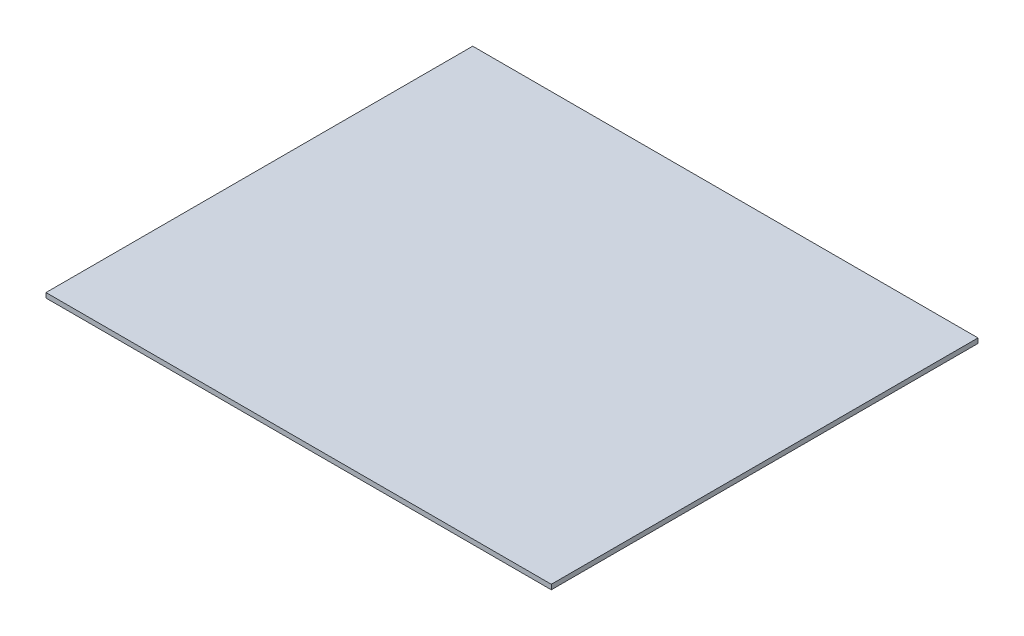
ISO-10303-21;
HEADER;
FILE_DESCRIPTION(('STEP AP214'),'2;1');
FILE_NAME('part.step','',(''),(''),'','','');
FILE_SCHEMA(('AUTOMOTIVE_DESIGN { 1 0 10303 214 1 1 1 1 }'));
ENDSEC;
DATA;
#1=APPLICATION_CONTEXT('core data for automotive mechanical design processes');
#2=APPLICATION_PROTOCOL_DEFINITION('international standard','automotive_design',2000,#1);
#3=PRODUCT_CONTEXT('',#1,'mechanical');
#4=PRODUCT('Part','Part','',(#3));
#5=PRODUCT_RELATED_PRODUCT_CATEGORY('part','',(#4));
#6=PRODUCT_DEFINITION_FORMATION('','',#4);
#7=PRODUCT_DEFINITION_CONTEXT('part definition',#1,'design');
#8=PRODUCT_DEFINITION('design','',#6,#7);
#9=PRODUCT_DEFINITION_SHAPE('','',#8);
#10=(LENGTH_UNIT() NAMED_UNIT(*) SI_UNIT(.MILLI.,.METRE.));
#11=(NAMED_UNIT(*) PLANE_ANGLE_UNIT() SI_UNIT($,.RADIAN.));
#12=(NAMED_UNIT(*) SI_UNIT($,.STERADIAN.) SOLID_ANGLE_UNIT());
#13=UNCERTAINTY_MEASURE_WITH_UNIT(LENGTH_MEASURE(1.E-05),#10,'distance_accuracy_value','');
#14=(GEOMETRIC_REPRESENTATION_CONTEXT(3) GLOBAL_UNCERTAINTY_ASSIGNED_CONTEXT((#13)) GLOBAL_UNIT_ASSIGNED_CONTEXT((#10,
#11,#12)) REPRESENTATION_CONTEXT('',''));
#15=CARTESIAN_POINT('',(0.,0.,0.));
#16=DIRECTION('',(0.,0.,1.));
#17=DIRECTION('',(1.,0.,0.));
#18=AXIS2_PLACEMENT_3D('',#15,#16,#17);
#19=CARTESIAN_POINT('',(-157.5,3.,-133.));
#20=DIRECTION('',(0.,0.,-1.));
#21=DIRECTION('',(-1.,0.,0.));
#22=AXIS2_PLACEMENT_3D('',#19,#20,#21);
#23=PLANE('',#22);
#24=DIRECTION('',(-1.,0.,0.));
#25=VECTOR('',#24,1.);
#26=CARTESIAN_POINT('',(102.25,2.,-133.));
#27=LINE('',#26,#25);
#28=CARTESIAN_POINT('',(102.25,2.,-133.));
#29=VERTEX_POINT('',#28);
#30=CARTESIAN_POINT('',(52.25,2.,-133.));
#31=VERTEX_POINT('',#30);
#32=EDGE_CURVE('E150',#29,#31,#27,.T.);
#33=ORIENTED_EDGE('',*,*,#32,.T.);
#34=DIRECTION('',(0.,-1.,0.));
#35=VECTOR('',#34,1.);
#36=CARTESIAN_POINT('',(52.25,2.,-133.));
#37=LINE('',#36,#35);
#38=CARTESIAN_POINT('',(52.25,0.,-133.));
#39=VERTEX_POINT('',#38);
#40=EDGE_CURVE('E131',#31,#39,#37,.T.);
#41=ORIENTED_EDGE('',*,*,#40,.T.);
#42=DIRECTION('',(1.,0.,0.));
#43=VECTOR('',#42,1.);
#44=CARTESIAN_POINT('',(-157.5,0.,-133.));
#45=LINE('',#44,#43);
#46=CARTESIAN_POINT('',(-52.25,0.,-133.));
#47=VERTEX_POINT('',#46);
#48=EDGE_CURVE('E242',#47,#39,#45,.T.);
#49=ORIENTED_EDGE('',*,*,#48,.F.);
#50=DIRECTION('',(0.,-1.,0.));
#51=VECTOR('',#50,1.);
#52=CARTESIAN_POINT('',(-52.25,2.,-133.));
#53=LINE('',#52,#51);
#54=CARTESIAN_POINT('',(-52.25,2.,-133.));
#55=VERTEX_POINT('',#54);
#56=EDGE_CURVE('E205',#55,#47,#53,.T.);
#57=ORIENTED_EDGE('',*,*,#56,.F.);
#58=DIRECTION('',(1.,0.,0.));
#59=VECTOR('',#58,1.);
#60=CARTESIAN_POINT('',(-102.25,2.,-133.));
#61=LINE('',#60,#59);
#62=CARTESIAN_POINT('',(-102.25,2.,-133.));
#63=VERTEX_POINT('',#62);
#64=EDGE_CURVE('E192',#63,#55,#61,.T.);
#65=ORIENTED_EDGE('',*,*,#64,.F.);
#66=DIRECTION('',(0.,-1.,0.));
#67=VECTOR('',#66,1.);
#68=CARTESIAN_POINT('',(-102.25,2.,-133.));
#69=LINE('',#68,#67);
#70=CARTESIAN_POINT('',(-102.25,0.,-133.));
#71=VERTEX_POINT('',#70);
#72=EDGE_CURVE('E209',#63,#71,#69,.T.);
#73=ORIENTED_EDGE('',*,*,#72,.T.);
#74=CARTESIAN_POINT('',(-157.5,0.,-133.));
#75=VERTEX_POINT('',#74);
#76=EDGE_CURVE('E237',#75,#71,#45,.T.);
#77=ORIENTED_EDGE('',*,*,#76,.F.);
#78=DIRECTION('',(0.,-1.,0.));
#79=VECTOR('',#78,1.);
#80=CARTESIAN_POINT('',(-157.5,3.,-133.));
#81=LINE('',#80,#79);
#82=CARTESIAN_POINT('',(-157.5,3.,-133.));
#83=VERTEX_POINT('',#82);
#84=EDGE_CURVE('E43',#83,#75,#81,.T.);
#85=ORIENTED_EDGE('',*,*,#84,.F.);
#86=DIRECTION('',(1.,0.,0.));
#87=VECTOR('',#86,1.);
#88=CARTESIAN_POINT('',(-157.5,3.,-133.));
#89=LINE('',#88,#87);
#90=CARTESIAN_POINT('',(157.5,3.,-133.));
#91=VERTEX_POINT('',#90);
#92=EDGE_CURVE('E222',#83,#91,#89,.T.);
#93=ORIENTED_EDGE('',*,*,#92,.T.);
#94=DIRECTION('',(0.,-1.,0.));
#95=VECTOR('',#94,1.);
#96=CARTESIAN_POINT('',(157.5,3.,-133.));
#97=LINE('',#96,#95);
#98=CARTESIAN_POINT('',(157.5,0.,-133.));
#99=VERTEX_POINT('',#98);
#100=EDGE_CURVE('E250',#91,#99,#97,.T.);
#101=ORIENTED_EDGE('',*,*,#100,.T.);
#102=CARTESIAN_POINT('',(102.25,0.,-133.));
#103=VERTEX_POINT('',#102);
#104=EDGE_CURVE('E236',#103,#99,#45,.T.);
#105=ORIENTED_EDGE('',*,*,#104,.F.);
#106=DIRECTION('',(0.,-1.,0.));
#107=VECTOR('',#106,1.);
#108=CARTESIAN_POINT('',(102.25,2.,-133.));
#109=LINE('',#108,#107);
#110=EDGE_CURVE('E57',#29,#103,#109,.T.);
#111=ORIENTED_EDGE('',*,*,#110,.F.);
#112=EDGE_LOOP('',(#33,#41,#49,#57,#65,#73,#77,#85,#93,#101,#105,#111));
#113=FACE_BOUND('',#112,.T.);
#114=ADVANCED_FACE('F39',(#113),#23,.T.);
#115=CARTESIAN_POINT('',(0.,0.,0.));
#116=DIRECTION('',(0.,-1.,0.));
#117=DIRECTION('',(0.,0.,-1.));
#118=AXIS2_PLACEMENT_3D('',#115,#116,#117);
#119=PLANE('',#118);
#120=ORIENTED_EDGE('',*,*,#48,.T.);
#121=DIRECTION('',(0.,0.,1.));
#122=VECTOR('',#121,1.);
#123=CARTESIAN_POINT('',(52.25,0.,-133.));
#124=LINE('',#123,#122);
#125=CARTESIAN_POINT('',(52.25,0.,-98.));
#126=VERTEX_POINT('',#125);
#127=EDGE_CURVE('E138',#39,#126,#124,.T.);
#128=ORIENTED_EDGE('',*,*,#127,.T.);
#129=DIRECTION('',(1.,0.,0.));
#130=VECTOR('',#129,1.);
#131=CARTESIAN_POINT('',(52.25,0.,-98.));
#132=LINE('',#131,#130);
#133=CARTESIAN_POINT('',(102.25,0.,-98.));
#134=VERTEX_POINT('',#133);
#135=EDGE_CURVE('E152',#126,#134,#132,.T.);
#136=ORIENTED_EDGE('',*,*,#135,.T.);
#137=DIRECTION('',(0.,0.,-1.));
#138=VECTOR('',#137,1.);
#139=CARTESIAN_POINT('',(102.25,0.,-98.));
#140=LINE('',#139,#138);
#141=EDGE_CURVE('E165',#134,#103,#140,.T.);
#142=ORIENTED_EDGE('',*,*,#141,.T.);
#143=ORIENTED_EDGE('',*,*,#104,.T.);
#144=DIRECTION('',(0.,0.,-1.));
#145=VECTOR('',#144,1.);
#146=CARTESIAN_POINT('',(157.5,0.,133.));
#147=LINE('',#146,#145);
#148=CARTESIAN_POINT('',(157.5,0.,133.));
#149=VERTEX_POINT('',#148);
#150=EDGE_CURVE('E241',#149,#99,#147,.T.);
#151=ORIENTED_EDGE('',*,*,#150,.F.);
#152=DIRECTION('',(1.,0.,0.));
#153=VECTOR('',#152,1.);
#154=CARTESIAN_POINT('',(-157.5,0.,133.));
#155=LINE('',#154,#153);
#156=CARTESIAN_POINT('',(-157.5,0.,133.));
#157=VERTEX_POINT('',#156);
#158=EDGE_CURVE('E223',#157,#149,#155,.T.);
#159=ORIENTED_EDGE('',*,*,#158,.F.);
#160=DIRECTION('',(0.,0.,-1.));
#161=VECTOR('',#160,1.);
#162=CARTESIAN_POINT('',(-157.5,0.,133.));
#163=LINE('',#162,#161);
#164=EDGE_CURVE('E208',#157,#75,#163,.T.);
#165=ORIENTED_EDGE('',*,*,#164,.T.);
#166=ORIENTED_EDGE('',*,*,#76,.T.);
#167=DIRECTION('',(0.,0.,-1.));
#168=VECTOR('',#167,1.);
#169=CARTESIAN_POINT('',(-102.25,0.,-98.));
#170=LINE('',#169,#168);
#171=CARTESIAN_POINT('',(-102.25,0.,-98.));
#172=VERTEX_POINT('',#171);
#173=EDGE_CURVE('E184',#172,#71,#170,.T.);
#174=ORIENTED_EDGE('',*,*,#173,.F.);
#175=DIRECTION('',(-1.,0.,0.));
#176=VECTOR('',#175,1.);
#177=CARTESIAN_POINT('',(-52.25,0.,-98.));
#178=LINE('',#177,#176);
#179=CARTESIAN_POINT('',(-52.25,0.,-98.));
#180=VERTEX_POINT('',#179);
#181=EDGE_CURVE('E199',#180,#172,#178,.T.);
#182=ORIENTED_EDGE('',*,*,#181,.F.);
#183=DIRECTION('',(0.,0.,1.));
#184=VECTOR('',#183,1.);
#185=CARTESIAN_POINT('',(-52.25,0.,-133.));
#186=LINE('',#185,#184);
#187=EDGE_CURVE('E65',#47,#180,#186,.T.);
#188=ORIENTED_EDGE('',*,*,#187,.F.);
#189=EDGE_LOOP('',(#120,#128,#136,#142,#143,#151,#159,#165,#166,#174,#182,#188));
#190=FACE_BOUND('',#189,.T.);
#191=ADVANCED_FACE('F264',(#190),#119,.T.);
#192=CARTESIAN_POINT('',(-157.5,3.,133.));
#193=DIRECTION('',(-1.,0.,0.));
#194=DIRECTION('',(0.,0.,1.));
#195=AXIS2_PLACEMENT_3D('',#192,#193,#194);
#196=PLANE('',#195);
#197=ORIENTED_EDGE('',*,*,#164,.F.);
#198=DIRECTION('',(0.,-1.,0.));
#199=VECTOR('',#198,1.);
#200=CARTESIAN_POINT('',(-157.5,3.,133.));
#201=LINE('',#200,#199);
#202=CARTESIAN_POINT('',(-157.5,3.,133.));
#203=VERTEX_POINT('',#202);
#204=EDGE_CURVE('E11',#203,#157,#201,.T.);
#205=ORIENTED_EDGE('',*,*,#204,.F.);
#206=DIRECTION('',(0.,0.,-1.));
#207=VECTOR('',#206,1.);
#208=CARTESIAN_POINT('',(-157.5,3.,133.));
#209=LINE('',#208,#207);
#210=EDGE_CURVE('E218',#203,#83,#209,.T.);
#211=ORIENTED_EDGE('',*,*,#210,.T.);
#212=ORIENTED_EDGE('',*,*,#84,.T.);
#213=EDGE_LOOP('',(#197,#205,#211,#212));
#214=FACE_BOUND('',#213,.T.);
#215=ADVANCED_FACE('F41',(#214),#196,.T.);
#216=CARTESIAN_POINT('',(-157.5,3.,133.));
#217=DIRECTION('',(0.,0.,-1.));
#218=DIRECTION('',(-1.,0.,0.));
#219=AXIS2_PLACEMENT_3D('',#216,#217,#218);
#220=PLANE('',#219);
#221=ORIENTED_EDGE('',*,*,#158,.T.);
#222=DIRECTION('',(0.,-1.,0.));
#223=VECTOR('',#222,1.);
#224=CARTESIAN_POINT('',(157.5,3.,133.));
#225=LINE('',#224,#223);
#226=CARTESIAN_POINT('',(157.5,3.,133.));
#227=VERTEX_POINT('',#226);
#228=EDGE_CURVE('E49',#227,#149,#225,.T.);
#229=ORIENTED_EDGE('',*,*,#228,.F.);
#230=DIRECTION('',(1.,0.,0.));
#231=VECTOR('',#230,1.);
#232=CARTESIAN_POINT('',(-157.5,3.,133.));
#233=LINE('',#232,#231);
#234=EDGE_CURVE('E230',#203,#227,#233,.T.);
#235=ORIENTED_EDGE('',*,*,#234,.F.);
#236=ORIENTED_EDGE('',*,*,#204,.T.);
#237=EDGE_LOOP('',(#221,#229,#235,#236));
#238=FACE_BOUND('',#237,.T.);
#239=ADVANCED_FACE('F268',(#238),#220,.F.);
#240=CARTESIAN_POINT('',(157.5,3.,133.));
#241=DIRECTION('',(-1.,0.,0.));
#242=DIRECTION('',(0.,0.,1.));
#243=AXIS2_PLACEMENT_3D('',#240,#241,#242);
#244=PLANE('',#243);
#245=ORIENTED_EDGE('',*,*,#150,.T.);
#246=ORIENTED_EDGE('',*,*,#100,.F.);
#247=DIRECTION('',(0.,0.,-1.));
#248=VECTOR('',#247,1.);
#249=CARTESIAN_POINT('',(157.5,3.,133.));
#250=LINE('',#249,#248);
#251=EDGE_CURVE('E227',#227,#91,#250,.T.);
#252=ORIENTED_EDGE('',*,*,#251,.F.);
#253=ORIENTED_EDGE('',*,*,#228,.T.);
#254=EDGE_LOOP('',(#245,#246,#252,#253));
#255=FACE_BOUND('',#254,.T.);
#256=ADVANCED_FACE('F272',(#255),#244,.F.);
#257=CARTESIAN_POINT('',(0.,3.,0.));
#258=DIRECTION('',(0.,-1.,0.));
#259=DIRECTION('',(0.,0.,-1.));
#260=AXIS2_PLACEMENT_3D('',#257,#258,#259);
#261=PLANE('',#260);
#262=ORIENTED_EDGE('',*,*,#210,.F.);
#263=ORIENTED_EDGE('',*,*,#234,.T.);
#264=ORIENTED_EDGE('',*,*,#251,.T.);
#265=ORIENTED_EDGE('',*,*,#92,.F.);
#266=EDGE_LOOP('',(#262,#263,#264,#265));
#267=FACE_BOUND('',#266,.T.);
#268=ADVANCED_FACE('F274',(#267),#261,.F.);
#269=CARTESIAN_POINT('',(-52.25,2.,-133.));
#270=DIRECTION('',(1.,0.,0.));
#271=DIRECTION('',(0.,0.,-1.));
#272=AXIS2_PLACEMENT_3D('',#269,#270,#271);
#273=PLANE('',#272);
#274=ORIENTED_EDGE('',*,*,#187,.T.);
#275=DIRECTION('',(0.,-1.,0.));
#276=VECTOR('',#275,1.);
#277=CARTESIAN_POINT('',(-52.25,2.,-98.));
#278=LINE('',#277,#276);
#279=CARTESIAN_POINT('',(-52.25,2.,-98.));
#280=VERTEX_POINT('',#279);
#281=EDGE_CURVE('E196',#280,#180,#278,.T.);
#282=ORIENTED_EDGE('',*,*,#281,.F.);
#283=DIRECTION('',(0.,0.,1.));
#284=VECTOR('',#283,1.);
#285=CARTESIAN_POINT('',(-52.25,2.,-133.));
#286=LINE('',#285,#284);
#287=EDGE_CURVE('E179',#55,#280,#286,.T.);
#288=ORIENTED_EDGE('',*,*,#287,.F.);
#289=ORIENTED_EDGE('',*,*,#56,.T.);
#290=EDGE_LOOP('',(#274,#282,#288,#289));
#291=FACE_BOUND('',#290,.T.);
#292=ADVANCED_FACE('F276',(#291),#273,.F.);
#293=CARTESIAN_POINT('',(-102.25,2.,-98.));
#294=DIRECTION('',(-1.,0.,0.));
#295=DIRECTION('',(0.,0.,1.));
#296=AXIS2_PLACEMENT_3D('',#293,#294,#295);
#297=PLANE('',#296);
#298=ORIENTED_EDGE('',*,*,#173,.T.);
#299=ORIENTED_EDGE('',*,*,#72,.F.);
#300=DIRECTION('',(0.,0.,-1.));
#301=VECTOR('',#300,1.);
#302=CARTESIAN_POINT('',(-102.25,2.,-98.));
#303=LINE('',#302,#301);
#304=CARTESIAN_POINT('',(-102.25,2.,-98.));
#305=VERTEX_POINT('',#304);
#306=EDGE_CURVE('E188',#305,#63,#303,.T.);
#307=ORIENTED_EDGE('',*,*,#306,.F.);
#308=DIRECTION('',(0.,-1.,0.));
#309=VECTOR('',#308,1.);
#310=CARTESIAN_POINT('',(-102.25,2.,-98.));
#311=LINE('',#310,#309);
#312=EDGE_CURVE('E213',#305,#172,#311,.T.);
#313=ORIENTED_EDGE('',*,*,#312,.T.);
#314=EDGE_LOOP('',(#298,#299,#307,#313));
#315=FACE_BOUND('',#314,.T.);
#316=ADVANCED_FACE('F282',(#315),#297,.F.);
#317=CARTESIAN_POINT('',(-52.25,2.,-98.));
#318=DIRECTION('',(0.,0.,1.));
#319=DIRECTION('',(1.,0.,0.));
#320=AXIS2_PLACEMENT_3D('',#317,#318,#319);
#321=PLANE('',#320);
#322=ORIENTED_EDGE('',*,*,#181,.T.);
#323=ORIENTED_EDGE('',*,*,#312,.F.);
#324=DIRECTION('',(-1.,0.,0.));
#325=VECTOR('',#324,1.);
#326=CARTESIAN_POINT('',(-52.25,2.,-98.));
#327=LINE('',#326,#325);
#328=EDGE_CURVE('E183',#280,#305,#327,.T.);
#329=ORIENTED_EDGE('',*,*,#328,.F.);
#330=ORIENTED_EDGE('',*,*,#281,.T.);
#331=EDGE_LOOP('',(#322,#323,#329,#330));
#332=FACE_BOUND('',#331,.T.);
#333=ADVANCED_FACE('F348',(#332),#321,.F.);
#334=CARTESIAN_POINT('',(0.,2.,0.));
#335=DIRECTION('',(0.,-1.,0.));
#336=DIRECTION('',(0.,0.,-1.));
#337=AXIS2_PLACEMENT_3D('',#334,#335,#336);
#338=PLANE('',#337);
#339=ORIENTED_EDGE('',*,*,#287,.T.);
#340=ORIENTED_EDGE('',*,*,#328,.T.);
#341=ORIENTED_EDGE('',*,*,#306,.T.);
#342=ORIENTED_EDGE('',*,*,#64,.T.);
#343=EDGE_LOOP('',(#339,#340,#341,#342));
#344=FACE_BOUND('',#343,.T.);
#345=ADVANCED_FACE('F315',(#344),#338,.T.);
#346=CARTESIAN_POINT('',(52.25,2.,-133.));
#347=DIRECTION('',(1.,0.,0.));
#348=DIRECTION('',(0.,0.,-1.));
#349=AXIS2_PLACEMENT_3D('',#346,#347,#348);
#350=PLANE('',#349);
#351=ORIENTED_EDGE('',*,*,#127,.F.);
#352=ORIENTED_EDGE('',*,*,#40,.F.);
#353=DIRECTION('',(0.,0.,1.));
#354=VECTOR('',#353,1.);
#355=CARTESIAN_POINT('',(52.25,2.,-133.));
#356=LINE('',#355,#354);
#357=CARTESIAN_POINT('',(52.25,2.,-98.));
#358=VERTEX_POINT('',#357);
#359=EDGE_CURVE('E135',#31,#358,#356,.T.);
#360=ORIENTED_EDGE('',*,*,#359,.T.);
#361=DIRECTION('',(0.,-1.,0.));
#362=VECTOR('',#361,1.);
#363=CARTESIAN_POINT('',(52.25,2.,-98.));
#364=LINE('',#363,#362);
#365=EDGE_CURVE('E171',#358,#126,#364,.T.);
#366=ORIENTED_EDGE('',*,*,#365,.T.);
#367=EDGE_LOOP('',(#351,#352,#360,#366));
#368=FACE_BOUND('',#367,.T.);
#369=ADVANCED_FACE('F133',(#368),#350,.T.);
#370=CARTESIAN_POINT('',(52.25,2.,-98.));
#371=DIRECTION('',(0.,0.,-1.));
#372=DIRECTION('',(-1.,0.,0.));
#373=AXIS2_PLACEMENT_3D('',#370,#371,#372);
#374=PLANE('',#373);
#375=ORIENTED_EDGE('',*,*,#135,.F.);
#376=ORIENTED_EDGE('',*,*,#365,.F.);
#377=DIRECTION('',(1.,0.,0.));
#378=VECTOR('',#377,1.);
#379=CARTESIAN_POINT('',(52.25,2.,-98.));
#380=LINE('',#379,#378);
#381=CARTESIAN_POINT('',(102.25,2.,-98.));
#382=VERTEX_POINT('',#381);
#383=EDGE_CURVE('E144',#358,#382,#380,.T.);
#384=ORIENTED_EDGE('',*,*,#383,.T.);
#385=DIRECTION('',(0.,-1.,0.));
#386=VECTOR('',#385,1.);
#387=CARTESIAN_POINT('',(102.25,2.,-98.));
#388=LINE('',#387,#386);
#389=EDGE_CURVE('E174',#382,#134,#388,.T.);
#390=ORIENTED_EDGE('',*,*,#389,.T.);
#391=EDGE_LOOP('',(#375,#376,#384,#390));
#392=FACE_BOUND('',#391,.T.);
#393=ADVANCED_FACE('F314',(#392),#374,.T.);
#394=CARTESIAN_POINT('',(102.25,2.,-98.));
#395=DIRECTION('',(-1.,0.,0.));
#396=DIRECTION('',(0.,0.,1.));
#397=AXIS2_PLACEMENT_3D('',#394,#395,#396);
#398=PLANE('',#397);
#399=ORIENTED_EDGE('',*,*,#141,.F.);
#400=ORIENTED_EDGE('',*,*,#389,.F.);
#401=DIRECTION('',(0.,0.,-1.));
#402=VECTOR('',#401,1.);
#403=CARTESIAN_POINT('',(102.25,2.,-98.));
#404=LINE('',#403,#402);
#405=EDGE_CURVE('E156',#382,#29,#404,.T.);
#406=ORIENTED_EDGE('',*,*,#405,.T.);
#407=ORIENTED_EDGE('',*,*,#110,.T.);
#408=EDGE_LOOP('',(#399,#400,#406,#407));
#409=FACE_BOUND('',#408,.T.);
#410=ADVANCED_FACE('F325',(#409),#398,.T.);
#411=CARTESIAN_POINT('',(0.,2.,0.));
#412=DIRECTION('',(0.,-1.,0.));
#413=DIRECTION('',(0.,0.,-1.));
#414=AXIS2_PLACEMENT_3D('',#411,#412,#413);
#415=PLANE('',#414);
#416=ORIENTED_EDGE('',*,*,#359,.F.);
#417=ORIENTED_EDGE('',*,*,#32,.F.);
#418=ORIENTED_EDGE('',*,*,#405,.F.);
#419=ORIENTED_EDGE('',*,*,#383,.F.);
#420=EDGE_LOOP('',(#416,#417,#418,#419));
#421=FACE_BOUND('',#420,.T.);
#422=ADVANCED_FACE('F148',(#421),#415,.T.);
#423=CLOSED_SHELL('',(#114,#191,#215,#239,#256,#268,#292,#316,#333,#345,#369,#393,#410,#422));
#424=MANIFOLD_SOLID_BREP('B2',#423);
#425=ADVANCED_BREP_SHAPE_REPRESENTATION('',(#18,#424),#14);
#426=SHAPE_DEFINITION_REPRESENTATION(#9,#425);
ENDSEC;
END-ISO-10303-21;
